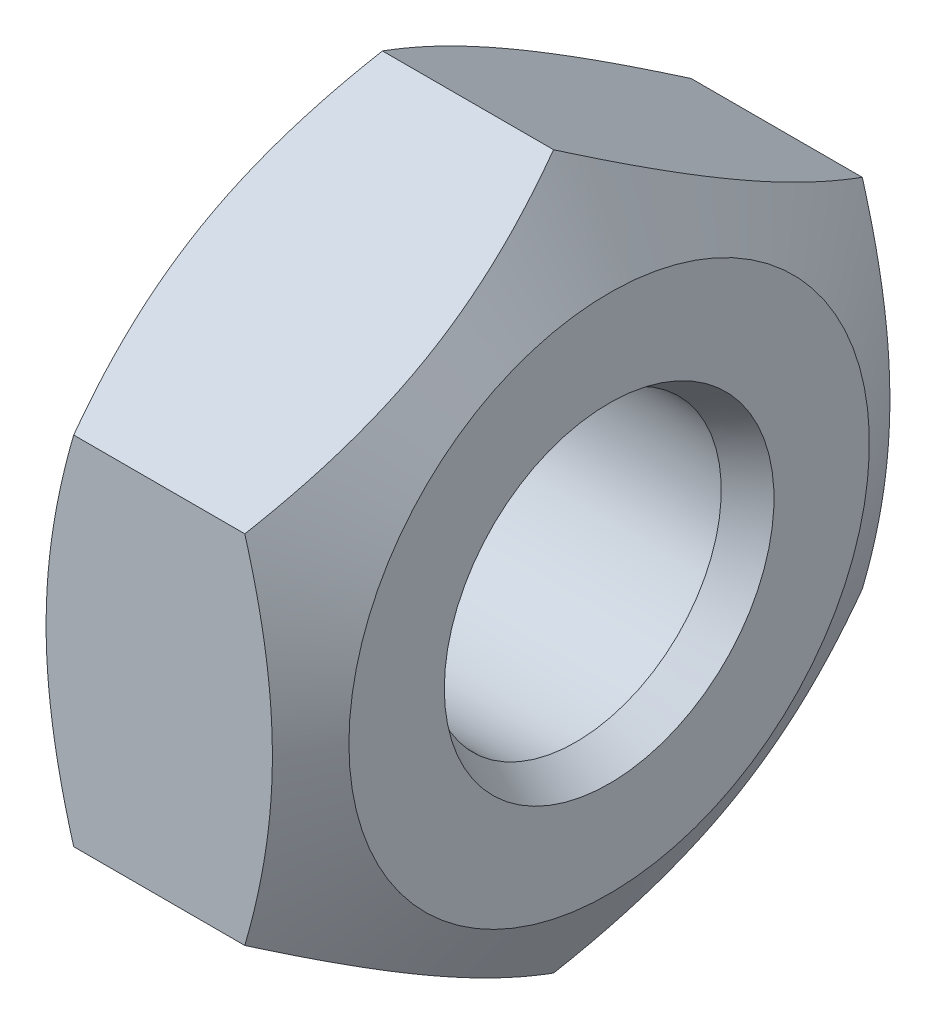
ISO-10303-21;
HEADER;
FILE_DESCRIPTION(('STEP AP214'),'2;1');
FILE_NAME('part.step','',(''),(''),'','','');
FILE_SCHEMA(('AUTOMOTIVE_DESIGN { 1 0 10303 214 1 1 1 1 }'));
ENDSEC;
DATA;
#1=APPLICATION_CONTEXT('core data for automotive mechanical design processes');
#2=APPLICATION_PROTOCOL_DEFINITION('international standard','automotive_design',2000,#1);
#3=PRODUCT_CONTEXT('',#1,'mechanical');
#4=PRODUCT('Part','Part','',(#3));
#5=PRODUCT_RELATED_PRODUCT_CATEGORY('part','',(#4));
#6=PRODUCT_DEFINITION_FORMATION('','',#4);
#7=PRODUCT_DEFINITION_CONTEXT('part definition',#1,'design');
#8=PRODUCT_DEFINITION('design','',#6,#7);
#9=PRODUCT_DEFINITION_SHAPE('','',#8);
#10=(LENGTH_UNIT() NAMED_UNIT(*) SI_UNIT(.MILLI.,.METRE.));
#11=(NAMED_UNIT(*) PLANE_ANGLE_UNIT() SI_UNIT($,.RADIAN.));
#12=(NAMED_UNIT(*) SI_UNIT($,.STERADIAN.) SOLID_ANGLE_UNIT());
#13=UNCERTAINTY_MEASURE_WITH_UNIT(LENGTH_MEASURE(1.E-05),#10,'distance_accuracy_value','');
#14=(GEOMETRIC_REPRESENTATION_CONTEXT(3) GLOBAL_UNCERTAINTY_ASSIGNED_CONTEXT((#13)) GLOBAL_UNIT_ASSIGNED_CONTEXT((#10,
#11,#12)) REPRESENTATION_CONTEXT('',''));
#15=CARTESIAN_POINT('',(0.,0.,0.));
#16=DIRECTION('',(0.,0.,1.));
#17=DIRECTION('',(1.,0.,0.));
#18=AXIS2_PLACEMENT_3D('',#15,#16,#17);
#19=CARTESIAN_POINT('',(3.2,-2.02072594216368,-3.50000000000001));
#20=DIRECTION('',(0.,0.866025403784438,0.500000000000001));
#21=DIRECTION('',(0.,-0.500000000000001,0.866025403784438));
#22=AXIS2_PLACEMENT_3D('',#19,#20,#21);
#23=PLANE('',#22);
#24=CARTESIAN_POINT('',(2.56978329125234,-4.04156735438122,0.000200000000001199));
#25=CARTESIAN_POINT('',(2.62107156295572,-3.9527667384984,-0.153607178452448));
#26=CARTESIAN_POINT('',(2.66771639812951,-3.86319960126198,-0.308742010834422));
#27=CARTESIAN_POINT('',(2.74913547641236,-3.68251437287562,-0.62169800657678));
#28=CARTESIAN_POINT('',(2.78388091636115,-3.59139307116725,-0.779524730787494));
#29=CARTESIAN_POINT('',(2.83796732476287,-3.41027974688034,-1.09322221038013));
#30=CARTESIAN_POINT('',(2.85766826568533,-3.32031559103708,-1.24904469916069));
#31=CARTESIAN_POINT('',(2.88118721920845,-3.13996396008051,-1.56142288720537));
#32=CARTESIAN_POINT('',(2.88502470740014,-3.04957714051106,-1.71797745103423));
#33=CARTESIAN_POINT('',(2.87704205006873,-2.88068384499777,-2.01050921992099));
#34=CARTESIAN_POINT('',(2.8671819178761,-2.80215208834114,-2.14653021245791));
#35=CARTESIAN_POINT('',(2.8359308850463,-2.64560020969753,-2.417686020289));
#36=CARTESIAN_POINT('',(2.81452930865991,-2.56758062920649,-2.55281989768469));
#37=CARTESIAN_POINT('',(2.76102694406513,-2.41070596159678,-2.82453479240519));
#38=CARTESIAN_POINT('',(2.72869935750062,-2.33187072981463,-2.96108141927834));
#39=CARTESIAN_POINT('',(2.65532841813771,-2.17537608630782,-3.23213809294451));
#40=CARTESIAN_POINT('',(2.61430230537584,-2.09771466960097,-3.36665161246854));
#41=CARTESIAN_POINT('',(2.56978329125233,-2.02061047210984,-3.50020000000001));
#42=B_SPLINE_CURVE_WITH_KNOTS('',3,(#24,#25,#26,#27,#28,#29,#30,#31,#32,#33,#34,#35,#36,#37,#38,
#39,#40,#41),.UNSPECIFIED.,.F.,.F.,(4,2,2,2,2,2,2,2,4),(0.,0.554793832886253,1.11092123814984,
1.65328467083219,2.19498204478403,2.6666513085086,3.13875761298268,3.62133612600511,
4.10296698719189),.UNSPECIFIED.);
#43=CARTESIAN_POINT('',(2.56984996077606,-4.04145188432738,0.));
#44=VERTEX_POINT('',#43);
#45=CARTESIAN_POINT('',(2.56984996077606,-2.02072594216367,-3.50000000000001));
#46=VERTEX_POINT('',#45);
#47=EDGE_CURVE('E156',#44,#46,#42,.T.);
#48=ORIENTED_EDGE('',*,*,#47,.F.);
#49=DIRECTION('',(-1.,0.,0.));
#50=VECTOR('',#49,1.);
#51=CARTESIAN_POINT('',(3.2,-4.04145188432738,0.));
#52=LINE('',#51,#50);
#53=CARTESIAN_POINT('',(0.630150039223937,-4.04145188432738,0.));
#54=VERTEX_POINT('',#53);
#55=EDGE_CURVE('E59',#44,#54,#52,.T.);
#56=ORIENTED_EDGE('',*,*,#55,.T.);
#57=CARTESIAN_POINT('',(0.630216708747666,-2.02061047210984,-3.50020000000001));
#58=CARTESIAN_POINT('',(0.578928437044278,-2.10941108799266,-3.34639282154756));
#59=CARTESIAN_POINT('',(0.532283601870491,-2.19897822522908,-3.19125798916558));
#60=CARTESIAN_POINT('',(0.450864523587642,-2.37966345361544,-2.87830199342323));
#61=CARTESIAN_POINT('',(0.416119083638855,-2.47078475532381,-2.72047526921251));
#62=CARTESIAN_POINT('',(0.362032675237129,-2.65189807961073,-2.40677778961988));
#63=CARTESIAN_POINT('',(0.342331734314674,-2.74186223545398,-2.25095530083932));
#64=CARTESIAN_POINT('',(0.318812780791547,-2.92221386641055,-1.93857711279464));
#65=CARTESIAN_POINT('',(0.314975292599857,-3.01260068598,-1.78202254896578));
#66=CARTESIAN_POINT('',(0.322957949931269,-3.18149398149329,-1.48949078007902));
#67=CARTESIAN_POINT('',(0.332818082123899,-3.26002573814992,-1.3534697875421));
#68=CARTESIAN_POINT('',(0.364069114953695,-3.41657761679353,-1.08231397971101));
#69=CARTESIAN_POINT('',(0.38547069134009,-3.49459719728457,-0.947180102315322));
#70=CARTESIAN_POINT('',(0.438973055934869,-3.65147186489428,-0.675465207594819));
#71=CARTESIAN_POINT('',(0.471300642499379,-3.73030709667643,-0.538918580721667));
#72=CARTESIAN_POINT('',(0.544671581862287,-3.88680174018324,-0.267861907055499));
#73=CARTESIAN_POINT('',(0.58569769462416,-3.96446315689009,-0.133348387531463));
#74=CARTESIAN_POINT('',(0.630216708747664,-4.04156735438122,0.000200000000001424));
#75=B_SPLINE_CURVE_WITH_KNOTS('',3,(#57,#58,#59,#60,#61,#62,#63,#64,#65,#66,#67,#68,#69,#70,#71,
#72,#73,#74),.UNSPECIFIED.,.F.,.F.,(4,2,2,2,2,2,2,2,4),(0.,0.554793832886254,1.11092123814984,
1.65328467083219,2.19498204478403,2.6666513085086,3.13875761298268,3.62133612600511,
4.10296698719189),.UNSPECIFIED.);
#76=CARTESIAN_POINT('',(0.630150039223936,-2.02072594216367,-3.50000000000001));
#77=VERTEX_POINT('',#76);
#78=EDGE_CURVE('E215',#77,#54,#75,.T.);
#79=ORIENTED_EDGE('',*,*,#78,.F.);
#80=DIRECTION('',(-1.,0.,0.));
#81=VECTOR('',#80,1.);
#82=CARTESIAN_POINT('',(3.2,-2.02072594216368,-3.50000000000001));
#83=LINE('',#82,#81);
#84=EDGE_CURVE('E118',#46,#77,#83,.T.);
#85=ORIENTED_EDGE('',*,*,#84,.F.);
#86=EDGE_LOOP('',(#48,#56,#79,#85));
#87=FACE_BOUND('',#86,.T.);
#88=ADVANCED_FACE('F36',(#87),#23,.F.);
#89=CARTESIAN_POINT('',(3.2,2.0207259421637,-3.5));
#90=DIRECTION('',(0.,0.,1.));
#91=DIRECTION('',(0.,-1.,0.));
#92=AXIS2_PLACEMENT_3D('',#89,#90,#91);
#93=PLANE('',#92);
#94=CARTESIAN_POINT('',(1.22881750910014,-5.31534493388153,-3.50000000000002));
#95=CARTESIAN_POINT('',(1.30207816774197,-5.16337150586968,-3.50000000000002));
#96=CARTESIAN_POINT('',(1.37460293102544,-5.01103682519248,-3.50000000000002));
#97=CARTESIAN_POINT('',(1.51776428424203,-4.70545235744445,-3.50000000000002));
#98=CARTESIAN_POINT('',(1.58840055206942,-4.55220241965024,-3.50000000000002));
#99=CARTESIAN_POINT('',(1.72774836769935,-4.24374984158163,-3.50000000000001));
#100=CARTESIAN_POINT('',(1.79644629584084,-4.08854102598779,-3.50000000000001));
#101=CARTESIAN_POINT('',(1.93087556872003,-3.77684861832702,-3.50000000000001));
#102=CARTESIAN_POINT('',(1.99660706195076,-3.62036509053324,-3.50000000000001));
#103=CARTESIAN_POINT('',(2.12617216830236,-3.30130426781152,-3.50000000000001));
#104=CARTESIAN_POINT('',(2.18989539750053,-3.13868189035815,-3.50000000000001));
#105=CARTESIAN_POINT('',(2.31224058125867,-2.81149349165561,-3.50000000000001));
#106=CARTESIAN_POINT('',(2.37086194817627,-2.64692724898107,-3.50000000000001));
#107=CARTESIAN_POINT('',(2.48138153487063,-2.31593556585887,-3.50000000000001));
#108=CARTESIAN_POINT('',(2.53329439951333,-2.14951506724053,-3.50000000000001));
#109=CARTESIAN_POINT('',(2.62865769049863,-1.81429094539312,-3.50000000000001));
#110=CARTESIAN_POINT('',(2.67211090435028,-1.64548812688332,-3.50000000000001));
#111=CARTESIAN_POINT('',(2.74817625698757,-1.30630440972835,-3.50000000000001));
#112=CARTESIAN_POINT('',(2.78084189447574,-1.13593574095327,-3.50000000000001));
#113=CARTESIAN_POINT('',(2.83340595665106,-0.79320358459167,-3.50000000000001));
#114=CARTESIAN_POINT('',(2.85330536551558,-0.620840251821487,-3.50000000000001));
#115=CARTESIAN_POINT('',(2.87848816001257,-0.27718102636793,-3.5));
#116=CARTESIAN_POINT('',(2.88395048933688,-0.105898574201126,-3.5));
#117=CARTESIAN_POINT('',(2.88026065819669,0.236519473244401,-3.5));
#118=CARTESIAN_POINT('',(2.87110792834333,0.407655062541592,-3.5));
#119=CARTESIAN_POINT('',(2.84346039336094,0.701638436528546,-3.5));
#120=CARTESIAN_POINT('',(2.82823113907009,0.824809499916818,-3.5));
#121=CARTESIAN_POINT('',(2.79121359731556,1.07016906914829,-3.5));
#122=CARTESIAN_POINT('',(2.76942431941153,1.19235742375876,-3.5));
#123=CARTESIAN_POINT('',(2.69537057809247,1.55733053597331,-3.5));
#124=CARTESIAN_POINT('',(2.63443630113293,1.7983714359046,-3.5));
#125=CARTESIAN_POINT('',(2.52979890480112,2.15868951119179,-3.5));
#126=CARTESIAN_POINT('',(2.4922454174654,2.27985774583447,-3.5));
#127=CARTESIAN_POINT('',(2.41349573385802,2.52101603071933,-3.5));
#128=CARTESIAN_POINT('',(2.37229951404977,2.64100607334336,-3.5));
#129=CARTESIAN_POINT('',(2.28690386635003,2.87985140269998,-3.5));
#130=CARTESIAN_POINT('',(2.24270558730768,2.9987071038914,-3.5));
#131=CARTESIAN_POINT('',(2.15179970569982,3.23545106190504,-3.5));
#132=CARTESIAN_POINT('',(2.10509212706971,3.35333932794295,-3.5));
#133=CARTESIAN_POINT('',(1.99576707227195,3.62226351383734,-3.49999999999999));
#134=CARTESIAN_POINT('',(1.93245758211188,3.77301755520712,-3.49999999999999));
#135=CARTESIAN_POINT('',(1.80307008137821,4.07333546686175,-3.49999999999999));
#136=CARTESIAN_POINT('',(1.73699193947818,4.22289928028879,-3.49999999999999));
#137=CARTESIAN_POINT('',(1.53542936124564,4.67014413648512,-3.49999999999999));
#138=CARTESIAN_POINT('',(1.39663597785816,4.96633237729335,-3.49999999999999));
#139=CARTESIAN_POINT('',(1.1131017284907,5.55613780883443,-3.49999999999999));
#140=CARTESIAN_POINT('',(0.968355783431691,5.84975253325498,-3.49999999999999));
#141=CARTESIAN_POINT('',(0.67480180556957,6.43495110573059,-3.49999999999999));
#142=CARTESIAN_POINT('',(0.525993643318091,6.72653488869429,-3.49999999999999));
#143=CARTESIAN_POINT('',(0.237223601941083,7.2854514785604,-3.49999999999999));
#144=CARTESIAN_POINT('',(0.0974800470422682,7.55289745017905,-3.49999999999999));
#145=CARTESIAN_POINT('',(-0.183879932060336,8.08681116226027,-3.49999999999998));
#146=CARTESIAN_POINT('',(-0.325496409833514,8.35327887446294,-3.49999999999998));
#147=CARTESIAN_POINT('',(-0.609861943688587,8.88487543784854,-3.49999999999998));
#148=CARTESIAN_POINT('',(-0.752607929708236,9.15000593362682,-3.49999999999998));
#149=CARTESIAN_POINT('',(-1.0392355381941,9.67963637677892,-3.49999999999998));
#150=CARTESIAN_POINT('',(-1.18311710652357,9.94413635343814,-3.49999999999998));
#151=CARTESIAN_POINT('',(-1.32742564189344,10.2084015957541,-3.49999999999998));
#152=B_SPLINE_CURVE_WITH_KNOTS('',3,(#94,#95,#96,#97,#98,#99,#100,#101,#102,#103,#104,#105,#106,
#107,#108,#109,#110,#111,#112,#113,#114,#115,#116,#117,#118,#119,#120,#121,#122,#123,#124,#125,
#126,#127,#128,#129,#130,#131,#132,#133,#134,#135,#136,#137,#138,#139,#140,#141,#142,#143,#144,
#145,#146,#147,#148,#149,#150,#151),.UNSPECIFIED.,.F.,.F.,(4,2,2,2,2,2,2,2,2,2,2,2,2,2,2,2,2,2,
2,2,2,2,2,2,2,2,2,2,4),(0.,0.50613661301502,1.012359010015,1.52153225888114,2.03067999134998,
2.55459882194197,3.07857791887156,3.6013931020691,4.12403572165925,4.64404605789454,
5.16401630054142,5.67751075354938,6.19102521230306,6.56316945137018,6.93536990542919,
7.68022703454046,8.06076107769419,8.44129757975158,8.82168926709603,9.2020773266499,
9.69256474762607,10.1830754604607,11.164246965171,12.1462737780821,13.1283319212975,
14.03358590692,14.9388658408781,15.8422096224822,16.7455105959103),.UNSPECIFIED.);
#153=CARTESIAN_POINT('',(2.56984996077606,2.0207259421637,-3.49999999999999));
#154=VERTEX_POINT('',#153);
#155=EDGE_CURVE('E161',#46,#154,#152,.T.);
#156=ORIENTED_EDGE('',*,*,#155,.F.);
#157=ORIENTED_EDGE('',*,*,#84,.T.);
#158=CARTESIAN_POINT('',(1.97118249089986,-5.31534493388153,-3.50000000000002));
#159=CARTESIAN_POINT('',(1.89792183225803,-5.16337150586969,-3.50000000000002));
#160=CARTESIAN_POINT('',(1.82539706897455,-5.01103682519248,-3.50000000000002));
#161=CARTESIAN_POINT('',(1.68223571575797,-4.70545235744445,-3.50000000000002));
#162=CARTESIAN_POINT('',(1.61159944793058,-4.55220241965025,-3.50000000000002));
#163=CARTESIAN_POINT('',(1.47225163230065,-4.24374984158163,-3.50000000000001));
#164=CARTESIAN_POINT('',(1.40355370415916,-4.08854102598779,-3.50000000000001));
#165=CARTESIAN_POINT('',(1.26912443127996,-3.77684861832702,-3.50000000000001));
#166=CARTESIAN_POINT('',(1.20339293804924,-3.62036509053324,-3.50000000000001));
#167=CARTESIAN_POINT('',(1.07382783169764,-3.30130426781152,-3.50000000000001));
#168=CARTESIAN_POINT('',(1.01010460249947,-3.13868189035815,-3.50000000000001));
#169=CARTESIAN_POINT('',(0.887759418741334,-2.81149349165561,-3.50000000000001));
#170=CARTESIAN_POINT('',(0.829138051823726,-2.64692724898107,-3.50000000000001));
#171=CARTESIAN_POINT('',(0.718618465129374,-2.31593556585887,-3.50000000000001));
#172=CARTESIAN_POINT('',(0.666705600486671,-2.14951506724053,-3.50000000000001));
#173=CARTESIAN_POINT('',(0.571342309501371,-1.81429094539312,-3.50000000000001));
#174=CARTESIAN_POINT('',(0.527889095649718,-1.64548812688332,-3.50000000000001));
#175=CARTESIAN_POINT('',(0.451823743012425,-1.30630440972835,-3.50000000000001));
#176=CARTESIAN_POINT('',(0.419158105524263,-1.13593574095327,-3.50000000000001));
#177=CARTESIAN_POINT('',(0.366594043348937,-0.793203584591671,-3.50000000000001));
#178=CARTESIAN_POINT('',(0.34669463448442,-0.620840251821487,-3.50000000000001));
#179=CARTESIAN_POINT('',(0.321511839987429,-0.27718102636793,-3.5));
#180=CARTESIAN_POINT('',(0.316049510663122,-0.105898574201125,-3.5));
#181=CARTESIAN_POINT('',(0.31973934180331,0.236519473244401,-3.5));
#182=CARTESIAN_POINT('',(0.328892071656669,0.407655062541592,-3.5));
#183=CARTESIAN_POINT('',(0.356539606639062,0.701638436528546,-3.5));
#184=CARTESIAN_POINT('',(0.371768860929915,0.824809499916819,-3.5));
#185=CARTESIAN_POINT('',(0.408786402684437,1.07016906914829,-3.5));
#186=CARTESIAN_POINT('',(0.430575680588469,1.19235742375876,-3.5));
#187=CARTESIAN_POINT('',(0.504629421907533,1.55733053597331,-3.5));
#188=CARTESIAN_POINT('',(0.565563698867068,1.7983714359046,-3.5));
#189=CARTESIAN_POINT('',(0.67020109519888,2.1586895111918,-3.5));
#190=CARTESIAN_POINT('',(0.707754582534603,2.27985774583447,-3.5));
#191=CARTESIAN_POINT('',(0.786504266141984,2.52101603071933,-3.5));
#192=CARTESIAN_POINT('',(0.827700485950232,2.64100607334337,-3.5));
#193=CARTESIAN_POINT('',(0.91309613364997,2.87985140269998,-3.5));
#194=CARTESIAN_POINT('',(0.95729441269232,2.9987071038914,-3.5));
#195=CARTESIAN_POINT('',(1.04820029430018,3.23545106190504,-3.5));
#196=CARTESIAN_POINT('',(1.09490787293029,3.35333932794295,-3.5));
#197=CARTESIAN_POINT('',(1.20423292772805,3.62226351383734,-3.49999999999999));
#198=CARTESIAN_POINT('',(1.26754241788812,3.77301755520712,-3.49999999999999));
#199=CARTESIAN_POINT('',(1.39692991862179,4.07333546686175,-3.49999999999999));
#200=CARTESIAN_POINT('',(1.46300806052182,4.22289928028879,-3.49999999999999));
#201=CARTESIAN_POINT('',(1.66457063875436,4.67014413648512,-3.49999999999999));
#202=CARTESIAN_POINT('',(1.80336402214184,4.96633237729335,-3.49999999999999));
#203=CARTESIAN_POINT('',(2.0868982715093,5.55613780883443,-3.49999999999999));
#204=CARTESIAN_POINT('',(2.23164421656831,5.84975253325498,-3.49999999999999));
#205=CARTESIAN_POINT('',(2.52519819443043,6.43495110573059,-3.49999999999999));
#206=CARTESIAN_POINT('',(2.67400635668191,6.72653488869429,-3.49999999999999));
#207=CARTESIAN_POINT('',(2.96277639805891,7.2854514785604,-3.49999999999999));
#208=CARTESIAN_POINT('',(3.10251995295773,7.55289745017905,-3.49999999999999));
#209=CARTESIAN_POINT('',(3.38387993206033,8.08681116226027,-3.49999999999998));
#210=CARTESIAN_POINT('',(3.52549640983351,8.35327887446294,-3.49999999999998));
#211=CARTESIAN_POINT('',(3.80986194368859,8.88487543784854,-3.49999999999998));
#212=CARTESIAN_POINT('',(3.95260792970824,9.15000593362682,-3.49999999999998));
#213=CARTESIAN_POINT('',(4.23923553819411,9.67963637677893,-3.49999999999998));
#214=CARTESIAN_POINT('',(4.38311710652357,9.94413635343814,-3.49999999999998));
#215=CARTESIAN_POINT('',(4.52742564189344,10.2084015957541,-3.49999999999998));
#216=B_SPLINE_CURVE_WITH_KNOTS('',3,(#158,#159,#160,#161,#162,#163,#164,#165,#166,#167,#168,
#169,#170,#171,#172,#173,#174,#175,#176,#177,#178,#179,#180,#181,#182,#183,#184,#185,#186,#187,
#188,#189,#190,#191,#192,#193,#194,#195,#196,#197,#198,#199,#200,#201,#202,#203,#204,#205,#206,
#207,#208,#209,#210,#211,#212,#213,#214,#215),.UNSPECIFIED.,.F.,.F.,(4,2,2,2,2,2,2,2,2,2,2,2,2,
2,2,2,2,2,2,2,2,2,2,2,2,2,2,2,4),(0.,0.506136613015021,1.012359010015,1.52153225888114,
2.03067999134998,2.55459882194197,3.07857791887155,3.6013931020691,4.12403572165925,
4.64404605789454,5.16401630054142,5.67751075354938,6.19102521230306,6.56316945137018,
6.93536990542919,7.68022703454047,8.0607610776942,8.44129757975158,8.82168926709603,
9.20207732664991,9.69256474762607,10.1830754604607,11.164246965171,12.1462737780821,
13.1283319212975,14.03358590692,14.9388658408781,15.8422096224822,16.7455105959103),.UNSPECIFIED.);
#217=CARTESIAN_POINT('',(0.630150039223936,2.0207259421637,-3.49999999999999));
#218=VERTEX_POINT('',#217);
#219=EDGE_CURVE('E208',#218,#77,#216,.F.);
#220=ORIENTED_EDGE('',*,*,#219,.F.);
#221=DIRECTION('',(-1.,0.,0.));
#222=VECTOR('',#221,1.);
#223=CARTESIAN_POINT('',(3.2,2.0207259421637,-3.5));
#224=LINE('',#223,#222);
#225=EDGE_CURVE('E112',#154,#218,#224,.T.);
#226=ORIENTED_EDGE('',*,*,#225,.F.);
#227=EDGE_LOOP('',(#156,#157,#220,#226));
#228=FACE_BOUND('',#227,.T.);
#229=ADVANCED_FACE('F220',(#228),#93,.F.);
#230=CARTESIAN_POINT('',(3.2,4.04145188432738,0.));
#231=DIRECTION('',(0.,-0.866025403784439,0.499999999999999));
#232=DIRECTION('',(0.,-0.499999999999999,-0.866025403784439));
#233=AXIS2_PLACEMENT_3D('',#230,#231,#232);
#234=PLANE('',#233);
#235=CARTESIAN_POINT('',(2.56978329125233,2.02061047210986,-3.5002));
#236=CARTESIAN_POINT('',(2.62107156295572,2.10941108799268,-3.34639282154755));
#237=CARTESIAN_POINT('',(2.66771639812951,2.1989782252291,-3.19125798916557));
#238=CARTESIAN_POINT('',(2.74913547641236,2.37966345361546,-2.87830199342322));
#239=CARTESIAN_POINT('',(2.78388091636114,2.47078475532383,-2.7204752692125));
#240=CARTESIAN_POINT('',(2.83796732476287,2.65189807961074,-2.40677778961987));
#241=CARTESIAN_POINT('',(2.85766826568532,2.741862235454,-2.2509553008393));
#242=CARTESIAN_POINT('',(2.88118721920845,2.92221386641056,-1.93857711279462));
#243=CARTESIAN_POINT('',(2.88502470740014,3.01260068598002,-1.78202254896577));
#244=CARTESIAN_POINT('',(2.87704205006873,3.1814939814933,-1.48949078007901));
#245=CARTESIAN_POINT('',(2.8671819178761,3.26002573814993,-1.35346978754209));
#246=CARTESIAN_POINT('',(2.8359308850463,3.41657761679354,-1.082313979711));
#247=CARTESIAN_POINT('',(2.81452930865991,3.49459719728458,-0.947180102315314));
#248=CARTESIAN_POINT('',(2.76102694406513,3.65147186489429,-0.675465207594813));
#249=CARTESIAN_POINT('',(2.72869935750062,3.73030709667644,-0.538918580721661));
#250=CARTESIAN_POINT('',(2.65532841813771,3.88680174018324,-0.267861907055496));
#251=CARTESIAN_POINT('',(2.61430230537584,3.96446315689009,-0.133348387531461));
#252=CARTESIAN_POINT('',(2.56978329125234,4.04156735438122,0.000200000000002146));
#253=B_SPLINE_CURVE_WITH_KNOTS('',3,(#235,#236,#237,#238,#239,#240,#241,#242,#243,#244,#245,
#246,#247,#248,#249,#250,#251,#252),.UNSPECIFIED.,.F.,.F.,(4,2,2,2,2,2,2,2,4),(0.,
0.554793832886254,1.11092123814984,1.65328467083219,2.19498204478403,2.6666513085086,
3.13875761298267,3.6213361260051,4.10296698719187),.UNSPECIFIED.);
#254=CARTESIAN_POINT('',(2.56984996077606,4.04145188432738,0.));
#255=VERTEX_POINT('',#254);
#256=EDGE_CURVE('E92',#154,#255,#253,.T.);
#257=ORIENTED_EDGE('',*,*,#256,.F.);
#258=ORIENTED_EDGE('',*,*,#225,.T.);
#259=CARTESIAN_POINT('',(0.630216708747665,4.04156735438122,0.000200000000002259));
#260=CARTESIAN_POINT('',(0.578928437044277,3.9527667384984,-0.153607178452447));
#261=CARTESIAN_POINT('',(0.532283601870491,3.86319960126198,-0.308742010834422));
#262=CARTESIAN_POINT('',(0.450864523587643,3.68251437287562,-0.62169800657678));
#263=CARTESIAN_POINT('',(0.416119083638856,3.59139307116725,-0.779524730787495));
#264=CARTESIAN_POINT('',(0.36203267523713,3.41027974688034,-1.09322221038013));
#265=CARTESIAN_POINT('',(0.342331734314676,3.32031559103708,-1.24904469916069));
#266=CARTESIAN_POINT('',(0.318812780791549,3.13996396008052,-1.56142288720537));
#267=CARTESIAN_POINT('',(0.31497529259986,3.04957714051106,-1.71797745103423));
#268=CARTESIAN_POINT('',(0.322957949931273,2.88068384499778,-2.01050921992099));
#269=CARTESIAN_POINT('',(0.332818082123902,2.80215208834115,-2.14653021245791));
#270=CARTESIAN_POINT('',(0.364069114953699,2.64560020969754,-2.41768602028899));
#271=CARTESIAN_POINT('',(0.385470691340093,2.5675806292065,-2.55281989768468));
#272=CARTESIAN_POINT('',(0.438973055934872,2.41070596159679,-2.82453479240518));
#273=CARTESIAN_POINT('',(0.471300642499382,2.33187072981464,-2.96108141927834));
#274=CARTESIAN_POINT('',(0.544671581862289,2.17537608630783,-3.2321380929445));
#275=CARTESIAN_POINT('',(0.585697694624161,2.09771466960099,-3.36665161246854));
#276=CARTESIAN_POINT('',(0.630216708747666,2.02061047210986,-3.5002));
#277=B_SPLINE_CURVE_WITH_KNOTS('',3,(#259,#260,#261,#262,#263,#264,#265,#266,#267,#268,#269,
#270,#271,#272,#273,#274,#275,#276),.UNSPECIFIED.,.F.,.F.,(4,2,2,2,2,2,2,2,4),(0.,
0.554793832886254,1.11092123814984,1.65328467083219,2.19498204478403,2.6666513085086,
3.13875761298267,3.6213361260051,4.10296698719187),.UNSPECIFIED.);
#278=CARTESIAN_POINT('',(0.630150039223936,4.04145188432738,0.));
#279=VERTEX_POINT('',#278);
#280=EDGE_CURVE('E201',#279,#218,#277,.T.);
#281=ORIENTED_EDGE('',*,*,#280,.F.);
#282=DIRECTION('',(-1.,0.,0.));
#283=VECTOR('',#282,1.);
#284=CARTESIAN_POINT('',(3.2,4.04145188432738,0.));
#285=LINE('',#284,#283);
#286=EDGE_CURVE('E110',#255,#279,#285,.T.);
#287=ORIENTED_EDGE('',*,*,#286,.F.);
#288=EDGE_LOOP('',(#257,#258,#281,#287));
#289=FACE_BOUND('',#288,.T.);
#290=ADVANCED_FACE('F223',(#289),#234,.F.);
#291=CARTESIAN_POINT('',(3.2,2.02072594216369,3.5));
#292=DIRECTION('',(0.,-0.866025403784438,-0.5));
#293=DIRECTION('',(0.,0.5,-0.866025403784438));
#294=AXIS2_PLACEMENT_3D('',#291,#292,#293);
#295=PLANE('',#294);
#296=CARTESIAN_POINT('',(2.56978329125234,4.04156735438122,-0.00019999999999778));
#297=CARTESIAN_POINT('',(2.62107156295572,3.9527667384984,0.153607178452452));
#298=CARTESIAN_POINT('',(2.66771639812951,3.86319960126198,0.308742010834426));
#299=CARTESIAN_POINT('',(2.74913547641236,3.68251437287562,0.621698006576783));
#300=CARTESIAN_POINT('',(2.78388091636115,3.59139307116725,0.779524730787498));
#301=CARTESIAN_POINT('',(2.83796732476287,3.41027974688034,1.09322221038013));
#302=CARTESIAN_POINT('',(2.85766826568533,3.32031559103708,1.24904469916069));
#303=CARTESIAN_POINT('',(2.88118721920845,3.13996396008051,1.56142288720538));
#304=CARTESIAN_POINT('',(2.88502470740014,3.04957714051106,1.71797745103423));
#305=CARTESIAN_POINT('',(2.87704205006873,2.88068384499777,2.01050921992099));
#306=CARTESIAN_POINT('',(2.8671819178761,2.80215208834114,2.14653021245791));
#307=CARTESIAN_POINT('',(2.8359308850463,2.64560020969753,2.417686020289));
#308=CARTESIAN_POINT('',(2.81452930865991,2.56758062920649,2.55281989768468));
#309=CARTESIAN_POINT('',(2.76102694406513,2.41070596159678,2.82453479240518));
#310=CARTESIAN_POINT('',(2.72869935750062,2.33187072981463,2.96108141927834));
#311=CARTESIAN_POINT('',(2.65532841813771,2.17537608630783,3.2321380929445));
#312=CARTESIAN_POINT('',(2.61430230537584,2.09771466960098,3.36665161246854));
#313=CARTESIAN_POINT('',(2.56978329125234,2.02061047210985,3.5002));
#314=B_SPLINE_CURVE_WITH_KNOTS('',3,(#296,#297,#298,#299,#300,#301,#302,#303,#304,#305,#306,
#307,#308,#309,#310,#311,#312,#313),.UNSPECIFIED.,.F.,.F.,(4,2,2,2,2,2,2,2,4),(0.,
0.554793832886254,1.11092123814984,1.65328467083219,2.19498204478403,2.6666513085086,
3.13875761298267,3.6213361260051,4.10296698719187),.UNSPECIFIED.);
#315=CARTESIAN_POINT('',(2.56984996077606,2.02072594216369,3.5));
#316=VERTEX_POINT('',#315);
#317=EDGE_CURVE('E89',#255,#316,#314,.T.);
#318=ORIENTED_EDGE('',*,*,#317,.F.);
#319=ORIENTED_EDGE('',*,*,#286,.T.);
#320=CARTESIAN_POINT('',(0.630216708747664,2.02061047210985,3.5002));
#321=CARTESIAN_POINT('',(0.578928437044277,2.10941108799267,3.34639282154755));
#322=CARTESIAN_POINT('',(0.53228360187049,2.19897822522909,3.19125798916558));
#323=CARTESIAN_POINT('',(0.450864523587642,2.37966345361545,2.87830199342322));
#324=CARTESIAN_POINT('',(0.416119083638855,2.47078475532382,2.7204752692125));
#325=CARTESIAN_POINT('',(0.362032675237129,2.65189807961073,2.40677778961987));
#326=CARTESIAN_POINT('',(0.342331734314675,2.74186223545399,2.25095530083931));
#327=CARTESIAN_POINT('',(0.318812780791548,2.92221386641056,1.93857711279463));
#328=CARTESIAN_POINT('',(0.314975292599859,3.01260068598001,1.78202254896577));
#329=CARTESIAN_POINT('',(0.322957949931271,3.1814939814933,1.48949078007901));
#330=CARTESIAN_POINT('',(0.332818082123901,3.26002573814993,1.35346978754209));
#331=CARTESIAN_POINT('',(0.364069114953697,3.41657761679354,1.08231397971101));
#332=CARTESIAN_POINT('',(0.385470691340092,3.49459719728458,0.947180102315318));
#333=CARTESIAN_POINT('',(0.438973055934871,3.65147186489429,0.675465207594817));
#334=CARTESIAN_POINT('',(0.471300642499381,3.73030709667644,0.538918580721666));
#335=CARTESIAN_POINT('',(0.544671581862288,3.88680174018324,0.2678619070555));
#336=CARTESIAN_POINT('',(0.585697694624161,3.96446315689009,0.133348387531465));
#337=CARTESIAN_POINT('',(0.630216708747664,4.04156735438122,-0.000199999999998141));
#338=B_SPLINE_CURVE_WITH_KNOTS('',3,(#320,#321,#322,#323,#324,#325,#326,#327,#328,#329,#330,
#331,#332,#333,#334,#335,#336,#337),.UNSPECIFIED.,.F.,.F.,(4,2,2,2,2,2,2,2,4),(0.,
0.554793832886254,1.11092123814984,1.65328467083219,2.19498204478403,2.6666513085086,
3.13875761298267,3.6213361260051,4.10296698719187),.UNSPECIFIED.);
#339=CARTESIAN_POINT('',(0.630150039223936,2.02072594216369,3.5));
#340=VERTEX_POINT('',#339);
#341=EDGE_CURVE('E109',#340,#279,#338,.T.);
#342=ORIENTED_EDGE('',*,*,#341,.F.);
#343=DIRECTION('',(-1.,0.,0.));
#344=VECTOR('',#343,1.);
#345=CARTESIAN_POINT('',(3.2,2.02072594216369,3.5));
#346=LINE('',#345,#344);
#347=EDGE_CURVE('E101',#316,#340,#346,.T.);
#348=ORIENTED_EDGE('',*,*,#347,.F.);
#349=EDGE_LOOP('',(#318,#319,#342,#348));
#350=FACE_BOUND('',#349,.T.);
#351=ADVANCED_FACE('F107',(#350),#295,.F.);
#352=CARTESIAN_POINT('',(3.2,-2.02072594216369,3.5));
#353=DIRECTION('',(0.,0.,-1.));
#354=DIRECTION('',(-1.,0.,0.));
#355=AXIS2_PLACEMENT_3D('',#352,#353,#354);
#356=PLANE('',#355);
#357=CARTESIAN_POINT('',(1.22881750912276,-5.31534493383462,3.5));
#358=CARTESIAN_POINT('',(1.30207816776364,-5.16337150582434,3.5));
#359=CARTESIAN_POINT('',(1.37460293104616,-5.01103682514871,3.5));
#360=CARTESIAN_POINT('',(1.51776428426085,-4.70545235740384,3.5));
#361=CARTESIAN_POINT('',(1.58840055208729,-4.55220241961121,3.5));
#362=CARTESIAN_POINT('',(1.72774836771532,-4.24374984154578,3.5));
#363=CARTESIAN_POINT('',(1.79644629585586,-4.08854102595355,3.5));
#364=CARTESIAN_POINT('',(1.93087556873317,-3.776848618296,3.5));
#365=CARTESIAN_POINT('',(1.99660706196297,-3.62036509050384,3.5));
#366=CARTESIAN_POINT('',(2.12617216831268,-3.30130426778546,3.5));
#367=CARTESIAN_POINT('',(2.18989539750991,-3.13868189033381,3.5));
#368=CARTESIAN_POINT('',(2.3122405812662,-2.81149349163474,3.5));
#369=CARTESIAN_POINT('',(2.37086194818292,-2.64692724896195,3.5));
#370=CARTESIAN_POINT('',(2.48138153487558,-2.31593556584329,3.5));
#371=CARTESIAN_POINT('',(2.53329439951748,-2.14951506722674,3.5));
#372=CARTESIAN_POINT('',(2.62865769050131,-1.81429094538294,3.5));
#373=CARTESIAN_POINT('',(2.6721109043523,-1.64548812687498,3.5));
#374=CARTESIAN_POINT('',(2.74817625698826,-1.30630440972467,3.5));
#375=CARTESIAN_POINT('',(2.78084189447582,-1.13593574095244,3.5));
#376=CARTESIAN_POINT('',(2.83340595665036,-0.793203584596583,3.5));
#377=CARTESIAN_POINT('',(2.85330536551471,-0.620840251829305,3.5));
#378=CARTESIAN_POINT('',(2.87848816001187,-0.277181026381506,3.5));
#379=CARTESIAN_POINT('',(2.88395048933651,-0.105898574217554,3.5));
#380=CARTESIAN_POINT('',(2.88026065819747,0.236519473222318,3.5));
#381=CARTESIAN_POINT('',(2.87110792834493,0.407655062516707,3.5));
#382=CARTESIAN_POINT('',(2.84346039336416,0.701638436500049,3.5));
#383=CARTESIAN_POINT('',(2.82823113907396,0.824809499887482,3.5));
#384=CARTESIAN_POINT('',(2.79121359732079,1.07016906911731,3.5));
#385=CARTESIAN_POINT('',(2.76942431941745,1.19235742372697,3.5));
#386=CARTESIAN_POINT('',(2.69537057810047,1.55733053593915,3.5));
#387=CARTESIAN_POINT('',(2.63443630114235,1.79837143586891,3.5));
#388=CARTESIAN_POINT('',(2.52979890481263,2.15868951115382,3.5));
#389=CARTESIAN_POINT('',(2.49224541747761,2.27985774579571,3.5));
#390=CARTESIAN_POINT('',(2.41349573387162,2.52101603067903,3.5));
#391=CARTESIAN_POINT('',(2.37229951406405,2.64100607330229,3.5));
#392=CARTESIAN_POINT('',(2.28690386636566,2.87985140265737,3.5));
#393=CARTESIAN_POINT('',(2.24270558732397,2.99870710384803,3.5));
#394=CARTESIAN_POINT('',(2.15179970571741,3.23545106186014,3.5));
#395=CARTESIAN_POINT('',(2.10509212708795,3.35333932789728,3.5));
#396=CARTESIAN_POINT('',(1.99576707229115,3.62226351379112,3.5));
#397=CARTESIAN_POINT('',(1.93245758213137,3.77301755516109,3.5));
#398=CARTESIAN_POINT('',(1.80307008139821,4.07333546681608,3.5));
#399=CARTESIAN_POINT('',(1.73699193949841,4.22289928024329,3.5));
#400=CARTESIAN_POINT('',(1.53542936126646,4.67014413644012,3.5));
#401=CARTESIAN_POINT('',(1.39663597787928,4.96633237724865,3.5));
#402=CARTESIAN_POINT('',(1.11310172851229,5.55613780879027,3.5));
#403=CARTESIAN_POINT('',(0.968355783453461,5.84975253321106,3.5));
#404=CARTESIAN_POINT('',(0.674801805591617,6.43495110568714,3.5));
#405=CARTESIAN_POINT('',(0.525993643340239,6.72653488865106,3.5));
#406=CARTESIAN_POINT('',(0.23722360196346,7.28545147851741,3.5));
#407=CARTESIAN_POINT('',(0.0974800470647769,7.55289745013609,3.5));
#408=CARTESIAN_POINT('',(-0.183879932037592,8.08681116221735,3.5));
#409=CARTESIAN_POINT('',(-0.325496409810666,8.35327887442003,3.5));
#410=CARTESIAN_POINT('',(-0.609861943665538,8.88487543780563,3.5));
#411=CARTESIAN_POINT('',(-0.752607929685089,9.15000593358389,3.5));
#412=CARTESIAN_POINT('',(-1.03923553817078,9.67963637673595,3.5));
#413=CARTESIAN_POINT('',(-1.18311710650015,9.94413635339514,3.5));
#414=CARTESIAN_POINT('',(-1.32742564186994,10.2084015957111,3.5));
#415=B_SPLINE_CURVE_WITH_KNOTS('',3,(#357,#358,#359,#360,#361,#362,#363,#364,#365,#366,#367,
#368,#369,#370,#371,#372,#373,#374,#375,#376,#377,#378,#379,#380,#381,#382,#383,#384,#385,#386,
#387,#388,#389,#390,#391,#392,#393,#394,#395,#396,#397,#398,#399,#400,#401,#402,#403,#404,#405,
#406,#407,#408,#409,#410,#411,#412,#413,#414),.UNSPECIFIED.,.F.,.F.,(4,2,2,2,2,2,2,2,2,2,2,2,2,
2,2,2,2,2,2,2,2,2,2,2,2,2,2,2,4),(0.,0.506136613009527,1.01235901000402,1.52153225886459,
2.03067999132788,2.55459882191402,3.07857791883776,3.60139310202948,4.12403572161381,
4.6440460578404,5.16401630047859,5.67751075347806,6.19102521222325,6.56316945128763,
6.93536990534389,7.68022703444967,8.06076107760056,8.44129757965509,8.8216892669967,
9.20207732654773,9.69256474752409,10.1830754603589,11.1642469650696,12.1462737779811,
13.128331921197,14.0335859068194,14.9388658407774,15.8422096223813,16.7455105958092),.UNSPECIFIED.);
#416=CARTESIAN_POINT('',(2.56984996077606,-2.02072594216369,3.5));
#417=VERTEX_POINT('',#416);
#418=EDGE_CURVE('E51',#316,#417,#415,.F.);
#419=ORIENTED_EDGE('',*,*,#418,.F.);
#420=ORIENTED_EDGE('',*,*,#347,.T.);
#421=CARTESIAN_POINT('',(1.97118249087724,-5.31534493383462,3.5));
#422=CARTESIAN_POINT('',(1.89792183223636,-5.16337150582434,3.5));
#423=CARTESIAN_POINT('',(1.82539706895383,-5.01103682514871,3.5));
#424=CARTESIAN_POINT('',(1.68223571573915,-4.70545235740384,3.5));
#425=CARTESIAN_POINT('',(1.61159944791271,-4.55220241961121,3.5));
#426=CARTESIAN_POINT('',(1.47225163228468,-4.24374984154578,3.5));
#427=CARTESIAN_POINT('',(1.40355370414414,-4.08854102595355,3.5));
#428=CARTESIAN_POINT('',(1.26912443126683,-3.776848618296,3.5));
#429=CARTESIAN_POINT('',(1.20339293803703,-3.62036509050384,3.5));
#430=CARTESIAN_POINT('',(1.07382783168732,-3.30130426778546,3.5));
#431=CARTESIAN_POINT('',(1.01010460249009,-3.13868189033381,3.5));
#432=CARTESIAN_POINT('',(0.887759418733797,-2.81149349163475,3.5));
#433=CARTESIAN_POINT('',(0.829138051817082,-2.64692724896195,3.5));
#434=CARTESIAN_POINT('',(0.718618465124425,-2.31593556584329,3.5));
#435=CARTESIAN_POINT('',(0.666705600482524,-2.14951506722674,3.5));
#436=CARTESIAN_POINT('',(0.57134230949869,-1.81429094538294,3.5));
#437=CARTESIAN_POINT('',(0.527889095647702,-1.64548812687498,3.5));
#438=CARTESIAN_POINT('',(0.451823743011739,-1.30630440972467,3.5));
#439=CARTESIAN_POINT('',(0.419158105524184,-1.13593574095244,3.5));
#440=CARTESIAN_POINT('',(0.366594043349635,-0.793203584596584,3.5));
#441=CARTESIAN_POINT('',(0.346694634485289,-0.620840251829305,3.5));
#442=CARTESIAN_POINT('',(0.321511839988127,-0.277181026381506,3.5));
#443=CARTESIAN_POINT('',(0.316049510663487,-0.105898574217554,3.5));
#444=CARTESIAN_POINT('',(0.319739341802527,0.236519473222318,3.5));
#445=CARTESIAN_POINT('',(0.328892071655073,0.407655062516706,3.5));
#446=CARTESIAN_POINT('',(0.356539606635839,0.701638436500049,3.5));
#447=CARTESIAN_POINT('',(0.371768860926037,0.824809499887481,3.5));
#448=CARTESIAN_POINT('',(0.408786402679214,1.07016906911731,3.5));
#449=CARTESIAN_POINT('',(0.430575680582554,1.19235742372697,3.5));
#450=CARTESIAN_POINT('',(0.504629421899529,1.55733053593915,3.5));
#451=CARTESIAN_POINT('',(0.565563698857649,1.79837143586891,3.5));
#452=CARTESIAN_POINT('',(0.670201095187369,2.15868951115382,3.5));
#453=CARTESIAN_POINT('',(0.707754582522389,2.27985774579571,3.5));
#454=CARTESIAN_POINT('',(0.786504266128384,2.52101603067903,3.5));
#455=CARTESIAN_POINT('',(0.827700485935948,2.6410060733023,3.5));
#456=CARTESIAN_POINT('',(0.91309613363434,2.87985140265738,3.5));
#457=CARTESIAN_POINT('',(0.957294412676028,2.99870710384803,3.5));
#458=CARTESIAN_POINT('',(1.04820029428259,3.23545106186014,3.5));
#459=CARTESIAN_POINT('',(1.09490787291205,3.35333932789729,3.5));
#460=CARTESIAN_POINT('',(1.20423292770885,3.62226351379112,3.5));
#461=CARTESIAN_POINT('',(1.26754241786863,3.77301755516109,3.5));
#462=CARTESIAN_POINT('',(1.39692991860179,4.07333546681608,3.5));
#463=CARTESIAN_POINT('',(1.46300806050159,4.2228992802433,3.5));
#464=CARTESIAN_POINT('',(1.66457063873354,4.67014413644012,3.5));
#465=CARTESIAN_POINT('',(1.80336402212072,4.96633237724865,3.5));
#466=CARTESIAN_POINT('',(2.08689827148771,5.55613780879027,3.5));
#467=CARTESIAN_POINT('',(2.23164421654654,5.84975253321107,3.5));
#468=CARTESIAN_POINT('',(2.52519819440838,6.43495110568715,3.5));
#469=CARTESIAN_POINT('',(2.67400635665976,6.72653488865107,3.5));
#470=CARTESIAN_POINT('',(2.96277639803654,7.28545147851741,3.5));
#471=CARTESIAN_POINT('',(3.10251995293522,7.55289745013609,3.5));
#472=CARTESIAN_POINT('',(3.38387993203759,8.08681116221735,3.5));
#473=CARTESIAN_POINT('',(3.52549640981066,8.35327887442003,3.5));
#474=CARTESIAN_POINT('',(3.80986194366554,8.88487543780563,3.5));
#475=CARTESIAN_POINT('',(3.95260792968509,9.15000593358389,3.5));
#476=CARTESIAN_POINT('',(4.23923553817077,9.67963637673595,3.5));
#477=CARTESIAN_POINT('',(4.38311710650015,9.94413635339514,3.5));
#478=CARTESIAN_POINT('',(4.52742564186994,10.2084015957111,3.5));
#479=B_SPLINE_CURVE_WITH_KNOTS('',3,(#421,#422,#423,#424,#425,#426,#427,#428,#429,#430,#431,
#432,#433,#434,#435,#436,#437,#438,#439,#440,#441,#442,#443,#444,#445,#446,#447,#448,#449,#450,
#451,#452,#453,#454,#455,#456,#457,#458,#459,#460,#461,#462,#463,#464,#465,#466,#467,#468,#469,
#470,#471,#472,#473,#474,#475,#476,#477,#478),.UNSPECIFIED.,.F.,.F.,(4,2,2,2,2,2,2,2,2,2,2,2,2,
2,2,2,2,2,2,2,2,2,2,2,2,2,2,2,4),(0.,0.506136613009527,1.01235901000402,1.52153225886459,
2.03067999132787,2.55459882191402,3.07857791883775,3.60139310202948,4.12403572161381,
4.6440460578404,5.16401630047859,5.67751075347806,6.19102521222325,6.56316945128763,
6.93536990534389,7.68022703444968,8.06076107760056,8.44129757965509,8.8216892669967,
9.20207732654773,9.69256474752409,10.1830754603589,11.1642469650696,12.1462737779811,
13.128331921197,14.0335859068194,14.9388658407774,15.8422096223813,16.7455105958092),.UNSPECIFIED.);
#480=CARTESIAN_POINT('',(0.630150039223936,-2.02072594216369,3.5));
#481=VERTEX_POINT('',#480);
#482=EDGE_CURVE('E159',#481,#340,#479,.T.);
#483=ORIENTED_EDGE('',*,*,#482,.F.);
#484=DIRECTION('',(-1.,0.,0.));
#485=VECTOR('',#484,1.);
#486=CARTESIAN_POINT('',(3.2,-2.02072594216369,3.5));
#487=LINE('',#486,#485);
#488=EDGE_CURVE('E103',#417,#481,#487,.T.);
#489=ORIENTED_EDGE('',*,*,#488,.F.);
#490=EDGE_LOOP('',(#419,#420,#483,#489));
#491=FACE_BOUND('',#490,.T.);
#492=ADVANCED_FACE('F99',(#491),#356,.F.);
#493=CARTESIAN_POINT('',(3.2,-4.04145188432738,0.));
#494=DIRECTION('',(0.,0.866025403784439,-0.5));
#495=DIRECTION('',(0.,0.5,0.866025403784439));
#496=AXIS2_PLACEMENT_3D('',#493,#494,#495);
#497=PLANE('',#496);
#498=CARTESIAN_POINT('',(2.56978329125234,-2.02061047210985,3.5002));
#499=CARTESIAN_POINT('',(2.62107156295572,-2.10941108799267,3.34639282154755));
#500=CARTESIAN_POINT('',(2.66771639812951,-2.19897822522909,3.19125798916558));
#501=CARTESIAN_POINT('',(2.74913547641236,-2.37966345361545,2.87830199342322));
#502=CARTESIAN_POINT('',(2.78388091636115,-2.47078475532382,2.7204752692125));
#503=CARTESIAN_POINT('',(2.83796732476287,-2.65189807961074,2.40677778961987));
#504=CARTESIAN_POINT('',(2.85766826568532,-2.74186223545399,2.25095530083931));
#505=CARTESIAN_POINT('',(2.88118721920845,-2.92221386641056,1.93857711279463));
#506=CARTESIAN_POINT('',(2.88502470740014,-3.01260068598001,1.78202254896577));
#507=CARTESIAN_POINT('',(2.87704205006873,-3.1814939814933,1.48949078007901));
#508=CARTESIAN_POINT('',(2.8671819178761,-3.26002573814993,1.35346978754209));
#509=CARTESIAN_POINT('',(2.8359308850463,-3.41657761679354,1.08231397971101));
#510=CARTESIAN_POINT('',(2.81452930865991,-3.49459719728458,0.947180102315318));
#511=CARTESIAN_POINT('',(2.76102694406513,-3.65147186489429,0.675465207594817));
#512=CARTESIAN_POINT('',(2.72869935750062,-3.73030709667644,0.538918580721665));
#513=CARTESIAN_POINT('',(2.65532841813771,-3.88680174018324,0.2678619070555));
#514=CARTESIAN_POINT('',(2.61430230537584,-3.96446315689009,0.133348387531465));
#515=CARTESIAN_POINT('',(2.56978329125234,-4.04156735438122,-0.000199999999998811));
#516=B_SPLINE_CURVE_WITH_KNOTS('',3,(#498,#499,#500,#501,#502,#503,#504,#505,#506,#507,#508,
#509,#510,#511,#512,#513,#514,#515),.UNSPECIFIED.,.F.,.F.,(4,2,2,2,2,2,2,2,4),(0.,
0.554793832886254,1.11092123814984,1.65328467083219,2.19498204478403,2.6666513085086,
3.13875761298267,3.6213361260051,4.10296698719187),.UNSPECIFIED.);
#517=EDGE_CURVE('E104',#417,#44,#516,.T.);
#518=ORIENTED_EDGE('',*,*,#517,.F.);
#519=ORIENTED_EDGE('',*,*,#488,.T.);
#520=CARTESIAN_POINT('',(0.630216708747665,-4.04156735438122,-0.000199999999998839));
#521=CARTESIAN_POINT('',(0.578928437044277,-3.9527667384984,0.153607178452451));
#522=CARTESIAN_POINT('',(0.532283601870491,-3.86319960126198,0.308742010834425));
#523=CARTESIAN_POINT('',(0.450864523587642,-3.68251437287562,0.621698006576782));
#524=CARTESIAN_POINT('',(0.416119083638855,-3.59139307116725,0.779524730787497));
#525=CARTESIAN_POINT('',(0.36203267523713,-3.41027974688034,1.09322221038013));
#526=CARTESIAN_POINT('',(0.342331734314675,-3.32031559103708,1.24904469916069));
#527=CARTESIAN_POINT('',(0.318812780791548,-3.13996396008052,1.56142288720538));
#528=CARTESIAN_POINT('',(0.314975292599859,-3.04957714051106,1.71797745103423));
#529=CARTESIAN_POINT('',(0.322957949931272,-2.88068384499777,2.01050921992099));
#530=CARTESIAN_POINT('',(0.332818082123901,-2.80215208834114,2.14653021245791));
#531=CARTESIAN_POINT('',(0.364069114953698,-2.64560020969753,2.417686020289));
#532=CARTESIAN_POINT('',(0.385470691340092,-2.5675806292065,2.55281989768468));
#533=CARTESIAN_POINT('',(0.438973055934871,-2.41070596159678,2.82453479240518));
#534=CARTESIAN_POINT('',(0.471300642499381,-2.33187072981463,2.96108141927834));
#535=CARTESIAN_POINT('',(0.544671581862288,-2.17537608630783,3.2321380929445));
#536=CARTESIAN_POINT('',(0.585697694624161,-2.09771466960098,3.36665161246854));
#537=CARTESIAN_POINT('',(0.630216708747665,-2.02061047210985,3.5002));
#538=B_SPLINE_CURVE_WITH_KNOTS('',3,(#520,#521,#522,#523,#524,#525,#526,#527,#528,#529,#530,
#531,#532,#533,#534,#535,#536,#537),.UNSPECIFIED.,.F.,.F.,(4,2,2,2,2,2,2,2,4),(0.,
0.554793832886254,1.11092123814984,1.65328467083219,2.19498204478403,2.6666513085086,
3.13875761298267,3.6213361260051,4.10296698719187),.UNSPECIFIED.);
#539=EDGE_CURVE('E155',#54,#481,#538,.T.);
#540=ORIENTED_EDGE('',*,*,#539,.F.);
#541=ORIENTED_EDGE('',*,*,#55,.F.);
#542=EDGE_LOOP('',(#518,#519,#540,#541));
#543=FACE_BOUND('',#542,.T.);
#544=ADVANCED_FACE('F183',(#543),#497,.F.);
#545=CARTESIAN_POINT('',(0.,0.,0.));
#546=DIRECTION('',(1.,0.,0.));
#547=DIRECTION('',(0.,0.,-1.));
#548=AXIS2_PLACEMENT_3D('',#545,#546,#547);
#549=CONICAL_SURFACE('',#548,2.95,1.0471975511966);
#550=CARTESIAN_POINT('',(0.,0.,0.));
#551=DIRECTION('',(-1.,0.,0.));
#552=DIRECTION('',(0.,0.,1.));
#553=AXIS2_PLACEMENT_3D('',#550,#551,#552);
#554=CIRCLE('',#553,2.95);
#555=CARTESIAN_POINT('',(0.,0.,2.95));
#556=VERTEX_POINT('',#555);
#557=EDGE_CURVE('E153',#556,#556,#554,.T.);
#558=ORIENTED_EDGE('',*,*,#557,.F.);
#559=EDGE_LOOP('',(#558));
#560=FACE_BOUND('',#559,.T.);
#561=ORIENTED_EDGE('',*,*,#78,.T.);
#562=ORIENTED_EDGE('',*,*,#539,.T.);
#563=ORIENTED_EDGE('',*,*,#482,.T.);
#564=ORIENTED_EDGE('',*,*,#341,.T.);
#565=ORIENTED_EDGE('',*,*,#280,.T.);
#566=ORIENTED_EDGE('',*,*,#219,.T.);
#567=EDGE_LOOP('',(#561,#562,#563,#564,#565,#566));
#568=FACE_BOUND('',#567,.T.);
#569=ADVANCED_FACE('F149',(#560,#568),#549,.T.);
#570=CARTESIAN_POINT('',(0.,-4.04145188432738,0.));
#571=DIRECTION('',(-1.,0.,0.));
#572=DIRECTION('',(0.,0.,1.));
#573=AXIS2_PLACEMENT_3D('',#570,#571,#572);
#574=PLANE('',#573);
#575=CARTESIAN_POINT('',(0.,0.,0.));
#576=DIRECTION('',(-1.,0.,0.));
#577=DIRECTION('',(0.,0.,1.));
#578=AXIS2_PLACEMENT_3D('',#575,#576,#577);
#579=CIRCLE('',#578,2.0288861141557);
#580=CARTESIAN_POINT('',(0.,0.,2.0288861141557));
#581=VERTEX_POINT('',#580);
#582=EDGE_CURVE('E11',#581,#581,#579,.F.);
#583=ORIENTED_EDGE('',*,*,#582,.T.);
#584=EDGE_LOOP('',(#583));
#585=FACE_BOUND('',#584,.T.);
#586=ORIENTED_EDGE('',*,*,#557,.T.);
#587=EDGE_LOOP('',(#586));
#588=FACE_BOUND('',#587,.T.);
#589=ADVANCED_FACE('F146',(#585,#588),#574,.T.);
#590=CARTESIAN_POINT('',(2.56984996077606,0.,0.));
#591=DIRECTION('',(-1.,0.,0.));
#592=DIRECTION('',(0.,0.,1.));
#593=AXIS2_PLACEMENT_3D('',#590,#591,#592);
#594=CONICAL_SURFACE('',#593,4.04145188432738,1.0471975511966);
#595=CARTESIAN_POINT('',(3.2,0.,0.));
#596=DIRECTION('',(-1.,0.,0.));
#597=DIRECTION('',(0.,0.,1.));
#598=AXIS2_PLACEMENT_3D('',#595,#596,#597);
#599=CIRCLE('',#598,2.95);
#600=CARTESIAN_POINT('',(3.2,0.,2.95));
#601=VERTEX_POINT('',#600);
#602=EDGE_CURVE('E341',#601,#601,#599,.T.);
#603=ORIENTED_EDGE('',*,*,#602,.T.);
#604=EDGE_LOOP('',(#603));
#605=FACE_BOUND('',#604,.T.);
#606=ORIENTED_EDGE('',*,*,#47,.T.);
#607=ORIENTED_EDGE('',*,*,#155,.T.);
#608=ORIENTED_EDGE('',*,*,#256,.T.);
#609=ORIENTED_EDGE('',*,*,#317,.T.);
#610=ORIENTED_EDGE('',*,*,#418,.T.);
#611=ORIENTED_EDGE('',*,*,#517,.T.);
#612=EDGE_LOOP('',(#606,#607,#608,#609,#610,#611));
#613=FACE_BOUND('',#612,.T.);
#614=ADVANCED_FACE('F90',(#605,#613),#594,.T.);
#615=CARTESIAN_POINT('',(3.2,-4.04145188432738,0.));
#616=DIRECTION('',(-1.,0.,0.));
#617=DIRECTION('',(0.,0.,1.));
#618=AXIS2_PLACEMENT_3D('',#615,#616,#617);
#619=PLANE('',#618);
#620=CARTESIAN_POINT('',(3.2,0.,0.));
#621=DIRECTION('',(-1.,0.,0.));
#622=DIRECTION('',(0.,0.,1.));
#623=AXIS2_PLACEMENT_3D('',#620,#621,#622);
#624=CIRCLE('',#623,1.86874999999999);
#625=CARTESIAN_POINT('',(3.2,0.,1.86874999999999));
#626=VERTEX_POINT('',#625);
#627=EDGE_CURVE('E44',#626,#626,#624,.T.);
#628=ORIENTED_EDGE('',*,*,#627,.T.);
#629=EDGE_LOOP('',(#628));
#630=FACE_BOUND('',#629,.T.);
#631=ORIENTED_EDGE('',*,*,#602,.F.);
#632=EDGE_LOOP('',(#631));
#633=FACE_BOUND('',#632,.T.);
#634=ADVANCED_FACE('F128',(#630,#633),#619,.F.);
#635=CARTESIAN_POINT('',(3.2,0.,0.));
#636=DIRECTION('',(1.,0.,0.));
#637=DIRECTION('',(0.,0.,-1.));
#638=AXIS2_PLACEMENT_3D('',#635,#636,#637);
#639=CYLINDRICAL_SURFACE('',#638,1.64999999999999);
#640=CARTESIAN_POINT('',(2.82111388584431,0.,0.));
#641=DIRECTION('',(-1.,0.,0.));
#642=DIRECTION('',(0.,0.,1.));
#643=AXIS2_PLACEMENT_3D('',#640,#641,#642);
#644=CIRCLE('',#643,1.64999999999999);
#645=CARTESIAN_POINT('',(2.82111388584431,0.,1.64999999999999));
#646=VERTEX_POINT('',#645);
#647=EDGE_CURVE('E123',#646,#646,#644,.F.);
#648=ORIENTED_EDGE('',*,*,#647,.T.);
#649=EDGE_LOOP('',(#648));
#650=FACE_BOUND('',#649,.T.);
#651=CARTESIAN_POINT('',(0.218750000000003,0.,0.));
#652=DIRECTION('',(-1.,0.,0.));
#653=DIRECTION('',(0.,0.,1.));
#654=AXIS2_PLACEMENT_3D('',#651,#652,#653);
#655=CIRCLE('',#654,1.64999999999999);
#656=CARTESIAN_POINT('',(0.218750000000003,0.,1.64999999999999));
#657=VERTEX_POINT('',#656);
#658=EDGE_CURVE('E120',#657,#657,#655,.T.);
#659=ORIENTED_EDGE('',*,*,#658,.T.);
#660=EDGE_LOOP('',(#659));
#661=FACE_BOUND('',#660,.T.);
#662=ADVANCED_FACE('F134',(#650,#661),#639,.F.);
#663=CARTESIAN_POINT('',(2.82111388584431,0.,0.));
#664=DIRECTION('',(1.,0.,0.));
#665=DIRECTION('',(0.,0.,-1.));
#666=AXIS2_PLACEMENT_3D('',#663,#664,#665);
#667=CONICAL_SURFACE('',#666,1.64999999999999,0.523598775598296);
#668=ORIENTED_EDGE('',*,*,#627,.F.);
#669=EDGE_LOOP('',(#668));
#670=FACE_BOUND('',#669,.T.);
#671=ORIENTED_EDGE('',*,*,#647,.F.);
#672=EDGE_LOOP('',(#671));
#673=FACE_BOUND('',#672,.T.);
#674=ADVANCED_FACE('F131',(#670,#673),#667,.F.);
#675=CARTESIAN_POINT('',(0.,0.,0.));
#676=DIRECTION('',(-1.,0.,0.));
#677=DIRECTION('',(0.,0.,1.));
#678=AXIS2_PLACEMENT_3D('',#675,#676,#677);
#679=CONICAL_SURFACE('',#678,2.0288861141557,1.0471975511966);
#680=ORIENTED_EDGE('',*,*,#658,.F.);
#681=EDGE_LOOP('',(#680));
#682=FACE_BOUND('',#681,.T.);
#683=ORIENTED_EDGE('',*,*,#582,.F.);
#684=EDGE_LOOP('',(#683));
#685=FACE_BOUND('',#684,.T.);
#686=ADVANCED_FACE('F38',(#682,#685),#679,.F.);
#687=CLOSED_SHELL('',(#88,#229,#290,#351,#492,#544,#569,#589,#614,#634,#662,#674,#686));
#688=MANIFOLD_SOLID_BREP('B2',#687);
#689=ADVANCED_BREP_SHAPE_REPRESENTATION('',(#18,#688),#14);
#690=SHAPE_DEFINITION_REPRESENTATION(#9,#689);
ENDSEC;
END-ISO-10303-21;
